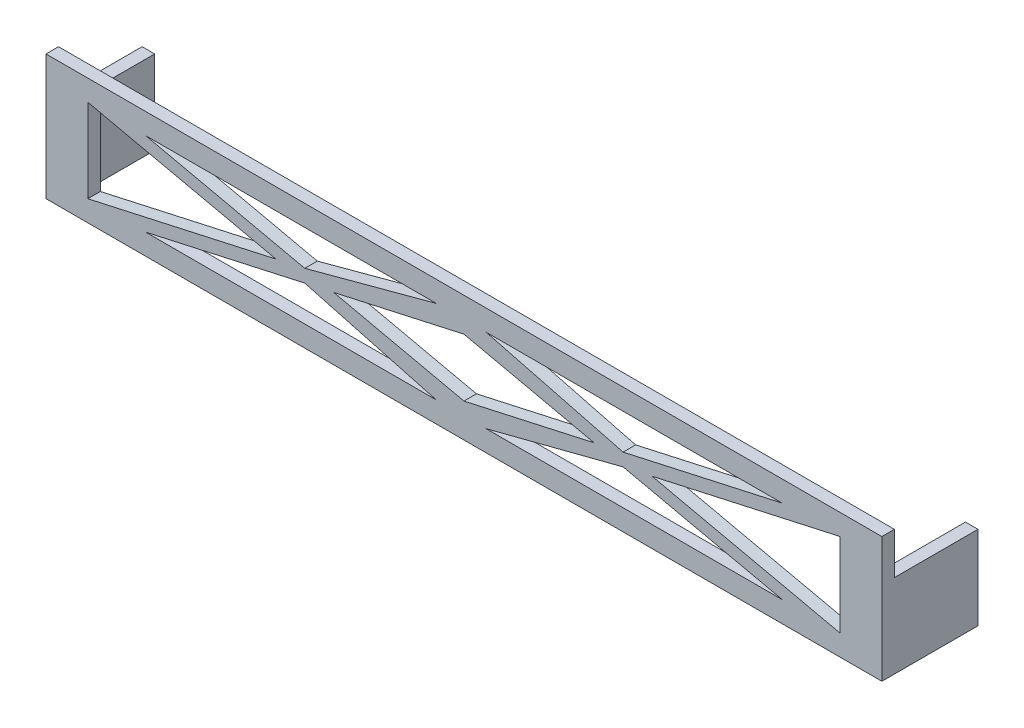
ISO-10303-21;
HEADER;
FILE_DESCRIPTION(('STEP AP214'),'2;1');
FILE_NAME('part.step','',(''),(''),'','','');
FILE_SCHEMA(('AUTOMOTIVE_DESIGN { 1 0 10303 214 1 1 1 1 }'));
ENDSEC;
DATA;
#1=APPLICATION_CONTEXT('core data for automotive mechanical design processes');
#2=APPLICATION_PROTOCOL_DEFINITION('international standard','automotive_design',2000,#1);
#3=PRODUCT_CONTEXT('',#1,'mechanical');
#4=PRODUCT('Part','Part','',(#3));
#5=PRODUCT_RELATED_PRODUCT_CATEGORY('part','',(#4));
#6=PRODUCT_DEFINITION_FORMATION('','',#4);
#7=PRODUCT_DEFINITION_CONTEXT('part definition',#1,'design');
#8=PRODUCT_DEFINITION('design','',#6,#7);
#9=PRODUCT_DEFINITION_SHAPE('','',#8);
#10=(LENGTH_UNIT() NAMED_UNIT(*) SI_UNIT(.MILLI.,.METRE.));
#11=(NAMED_UNIT(*) PLANE_ANGLE_UNIT() SI_UNIT($,.RADIAN.));
#12=(NAMED_UNIT(*) SI_UNIT($,.STERADIAN.) SOLID_ANGLE_UNIT());
#13=UNCERTAINTY_MEASURE_WITH_UNIT(LENGTH_MEASURE(1.E-05),#10,'distance_accuracy_value','');
#14=(GEOMETRIC_REPRESENTATION_CONTEXT(3) GLOBAL_UNCERTAINTY_ASSIGNED_CONTEXT((#13)) GLOBAL_UNIT_ASSIGNED_CONTEXT((#10,
#11,#12)) REPRESENTATION_CONTEXT('',''));
#15=CARTESIAN_POINT('',(0.,0.,0.));
#16=DIRECTION('',(0.,0.,1.));
#17=DIRECTION('',(1.,0.,0.));
#18=AXIS2_PLACEMENT_3D('',#15,#16,#17);
#19=CARTESIAN_POINT('',(0.,0.,3.));
#20=DIRECTION('',(0.,0.,1.));
#21=DIRECTION('',(1.,0.,0.));
#22=AXIS2_PLACEMENT_3D('',#19,#20,#21);
#23=PLANE('',#22);
#24=DIRECTION('',(0.,1.,0.));
#25=VECTOR('',#24,1.);
#26=CARTESIAN_POINT('',(-18.1595795878819,48.8517745302714,3.));
#27=LINE('',#26,#25);
#28=CARTESIAN_POINT('',(-18.1595795878819,18.8517745302714,3.));
#29=VERTEX_POINT('',#28);
#30=CARTESIAN_POINT('',(-18.1595795878819,48.8517745302714,3.));
#31=VERTEX_POINT('',#30);
#32=EDGE_CURVE('E476',#29,#31,#27,.T.);
#33=ORIENTED_EDGE('',*,*,#32,.T.);
#34=DIRECTION('',(-1.,0.,0.));
#35=VECTOR('',#34,1.);
#36=CARTESIAN_POINT('',(-218.159579587882,48.8517745302714,3.));
#37=LINE('',#36,#35);
#38=CARTESIAN_POINT('',(-218.159579587882,48.8517745302714,3.));
#39=VERTEX_POINT('',#38);
#40=EDGE_CURVE('E478',#31,#39,#37,.T.);
#41=ORIENTED_EDGE('',*,*,#40,.T.);
#42=DIRECTION('',(0.,-1.,0.));
#43=VECTOR('',#42,1.);
#44=CARTESIAN_POINT('',(-218.159579587882,48.8517745302714,3.));
#45=LINE('',#44,#43);
#46=CARTESIAN_POINT('',(-218.159579587882,18.8517745302714,3.));
#47=VERTEX_POINT('',#46);
#48=EDGE_CURVE('E471',#39,#47,#45,.T.);
#49=ORIENTED_EDGE('',*,*,#48,.T.);
#50=DIRECTION('',(1.,0.,0.));
#51=VECTOR('',#50,1.);
#52=CARTESIAN_POINT('',(-218.159579587882,18.8517745302714,3.));
#53=LINE('',#52,#51);
#54=EDGE_CURVE('E473',#47,#29,#53,.T.);
#55=ORIENTED_EDGE('',*,*,#54,.T.);
#56=EDGE_LOOP('',(#33,#41,#49,#55));
#57=FACE_BOUND('',#56,.T.);
#58=DIRECTION('',(0.976187060183952,0.216930457818658,0.));
#59=VECTOR('',#58,1.);
#60=CARTESIAN_POINT('',(-163.159579587882,33.8517745302714,3.));
#61=LINE('',#60,#59);
#62=CARTESIAN_POINT('',(-208.159579587882,23.8517745302713,3.));
#63=VERTEX_POINT('',#62);
#64=CARTESIAN_POINT('',(-163.159579587882,33.8517745302714,3.));
#65=VERTEX_POINT('',#64);
#66=EDGE_CURVE('E449',#63,#65,#61,.T.);
#67=ORIENTED_EDGE('',*,*,#66,.F.);
#68=DIRECTION('',(0.,-1.,0.));
#69=VECTOR('',#68,1.);
#70=CARTESIAN_POINT('',(-208.159579587882,43.8517745302714,3.));
#71=LINE('',#70,#69);
#72=CARTESIAN_POINT('',(-208.159579587882,43.8517745302714,3.));
#73=VERTEX_POINT('',#72);
#74=EDGE_CURVE('E447',#73,#63,#71,.T.);
#75=ORIENTED_EDGE('',*,*,#74,.F.);
#76=DIRECTION('',(-0.976187060183953,0.216930457818656,0.));
#77=VECTOR('',#76,1.);
#78=CARTESIAN_POINT('',(-208.159579587882,43.8517745302714,3.));
#79=LINE('',#78,#77);
#80=EDGE_CURVE('E453',#65,#73,#79,.T.);
#81=ORIENTED_EDGE('',*,*,#80,.F.);
#82=EDGE_LOOP('',(#67,#75,#81));
#83=FACE_BOUND('',#82,.T.);
#84=DIRECTION('',(0.,1.,0.));
#85=VECTOR('',#84,1.);
#86=CARTESIAN_POINT('',(-28.1595795878819,43.8517745302714,3.));
#87=LINE('',#86,#85);
#88=CARTESIAN_POINT('',(-28.1595795878819,23.8517745302714,3.));
#89=VERTEX_POINT('',#88);
#90=CARTESIAN_POINT('',(-28.1595795878819,43.8517745302714,3.));
#91=VERTEX_POINT('',#90);
#92=EDGE_CURVE('E425',#89,#91,#87,.T.);
#93=ORIENTED_EDGE('',*,*,#92,.F.);
#94=DIRECTION('',(0.976187060183953,-0.216930457818656,0.));
#95=VECTOR('',#94,1.);
#96=CARTESIAN_POINT('',(-73.1595795878819,33.8517745302714,3.));
#97=LINE('',#96,#95);
#98=CARTESIAN_POINT('',(-73.1595795878819,33.8517745302714,3.));
#99=VERTEX_POINT('',#98);
#100=EDGE_CURVE('E423',#99,#89,#97,.T.);
#101=ORIENTED_EDGE('',*,*,#100,.F.);
#102=DIRECTION('',(-0.976187060183953,-0.216930457818656,0.));
#103=VECTOR('',#102,1.);
#104=CARTESIAN_POINT('',(-28.1595795878819,43.8517745302714,3.));
#105=LINE('',#104,#103);
#106=EDGE_CURVE('E429',#91,#99,#105,.T.);
#107=ORIENTED_EDGE('',*,*,#106,.F.);
#108=EDGE_LOOP('',(#93,#101,#107));
#109=FACE_BOUND('',#108,.T.);
#110=DIRECTION('',(-0.965694542063238,0.259680672036394,0.));
#111=VECTOR('',#110,1.);
#112=CARTESIAN_POINT('',(-156.244921244912,32.3151837873893,3.));
#113=LINE('',#112,#111);
#114=CARTESIAN_POINT('',(-124.771388529698,23.8517745302714,3.));
#115=VERTEX_POINT('',#114);
#116=CARTESIAN_POINT('',(-156.244921244912,32.3151837873893,3.));
#117=VERTEX_POINT('',#116);
#118=EDGE_CURVE('E401',#115,#117,#113,.T.);
#119=ORIENTED_EDGE('',*,*,#118,.F.);
#120=DIRECTION('',(1.,0.,0.));
#121=VECTOR('',#120,1.);
#122=CARTESIAN_POINT('',(-194.330262901943,23.8517745302713,3.));
#123=LINE('',#122,#121);
#124=CARTESIAN_POINT('',(-194.330262901943,23.8517745302713,3.));
#125=VERTEX_POINT('',#124);
#126=EDGE_CURVE('E399',#125,#115,#123,.T.);
#127=ORIENTED_EDGE('',*,*,#126,.F.);
#128=DIRECTION('',(-0.976187060183952,-0.216930457818658,0.));
#129=VECTOR('',#128,1.);
#130=CARTESIAN_POINT('',(-194.330262901943,23.8517745302713,3.));
#131=LINE('',#130,#129);
#132=EDGE_CURVE('E405',#117,#125,#131,.T.);
#133=ORIENTED_EDGE('',*,*,#132,.F.);
#134=EDGE_LOOP('',(#119,#127,#133));
#135=FACE_BOUND('',#134,.T.);
#136=DIRECTION('',(0.976187060183953,-0.216930457818656,0.));
#137=VECTOR('',#136,1.);
#138=CARTESIAN_POINT('',(-194.330262901943,43.8517745302714,3.));
#139=LINE('',#138,#137);
#140=CARTESIAN_POINT('',(-194.330262901943,43.8517745302714,3.));
#141=VERTEX_POINT('',#140);
#142=CARTESIAN_POINT('',(-156.244921244912,35.3883652731535,3.));
#143=VERTEX_POINT('',#142);
#144=EDGE_CURVE('E377',#141,#143,#139,.T.);
#145=ORIENTED_EDGE('',*,*,#144,.F.);
#146=DIRECTION('',(-1.,0.,0.));
#147=VECTOR('',#146,1.);
#148=CARTESIAN_POINT('',(-124.771388529698,43.8517745302714,3.));
#149=LINE('',#148,#147);
#150=CARTESIAN_POINT('',(-124.771388529698,43.8517745302714,3.));
#151=VERTEX_POINT('',#150);
#152=EDGE_CURVE('E375',#151,#141,#149,.T.);
#153=ORIENTED_EDGE('',*,*,#152,.F.);
#154=DIRECTION('',(0.965694542063238,0.259680672036393,0.));
#155=VECTOR('',#154,1.);
#156=CARTESIAN_POINT('',(-156.244921244912,35.3883652731535,3.));
#157=LINE('',#156,#155);
#158=EDGE_CURVE('E381',#143,#151,#157,.T.);
#159=ORIENTED_EDGE('',*,*,#158,.F.);
#160=EDGE_LOOP('',(#145,#153,#159));
#161=FACE_BOUND('',#160,.T.);
#162=DIRECTION('',(-0.976187060183952,0.216930457818658,0.));
#163=VECTOR('',#162,1.);
#164=CARTESIAN_POINT('',(-118.159579587882,40.7785930445072,3.));
#165=LINE('',#164,#163);
#166=CARTESIAN_POINT('',(-86.9888962738211,33.8517745302714,3.));
#167=VERTEX_POINT('',#166);
#168=CARTESIAN_POINT('',(-118.159579587882,40.7785930445072,3.));
#169=VERTEX_POINT('',#168);
#170=EDGE_CURVE('E346',#167,#169,#165,.T.);
#171=ORIENTED_EDGE('',*,*,#170,.F.);
#172=DIRECTION('',(0.976187060183953,0.216930457818656,0.));
#173=VECTOR('',#172,1.);
#174=CARTESIAN_POINT('',(-86.9888962738211,33.8517745302714,3.));
#175=LINE('',#174,#173);
#176=CARTESIAN_POINT('',(-118.159579587882,26.9249560160357,3.));
#177=VERTEX_POINT('',#176);
#178=EDGE_CURVE('E344',#177,#167,#175,.T.);
#179=ORIENTED_EDGE('',*,*,#178,.F.);
#180=DIRECTION('',(0.976187060183953,-0.216930457818656,0.));
#181=VECTOR('',#180,1.);
#182=CARTESIAN_POINT('',(-149.330262901943,33.8517745302714,3.));
#183=LINE('',#182,#181);
#184=CARTESIAN_POINT('',(-149.330262901943,33.8517745302714,3.));
#185=VERTEX_POINT('',#184);
#186=EDGE_CURVE('E352',#185,#177,#183,.T.);
#187=ORIENTED_EDGE('',*,*,#186,.F.);
#188=DIRECTION('',(-0.976187060183952,-0.216930457818658,0.));
#189=VECTOR('',#188,1.);
#190=CARTESIAN_POINT('',(-118.159579587882,40.7785930445072,3.));
#191=LINE('',#190,#189);
#192=EDGE_CURVE('E349',#169,#185,#191,.T.);
#193=ORIENTED_EDGE('',*,*,#192,.F.);
#194=EDGE_LOOP('',(#171,#179,#187,#193));
#195=FACE_BOUND('',#194,.T.);
#196=DIRECTION('',(1.,0.,0.));
#197=VECTOR('',#196,1.);
#198=CARTESIAN_POINT('',(-112.871999427657,23.8517745302714,3.));
#199=LINE('',#198,#197);
#200=CARTESIAN_POINT('',(-112.871999427657,23.8517745302714,3.));
#201=VERTEX_POINT('',#200);
#202=CARTESIAN_POINT('',(-41.9888962738212,23.8517745302714,3.));
#203=VERTEX_POINT('',#202);
#204=EDGE_CURVE('E322',#201,#203,#199,.T.);
#205=ORIENTED_EDGE('',*,*,#204,.F.);
#206=DIRECTION('',(-0.968281103667412,-0.249863371226394,0.));
#207=VECTOR('',#206,1.);
#208=CARTESIAN_POINT('',(-80.0742379308515,32.3151837873893,3.));
#209=LINE('',#208,#207);
#210=CARTESIAN_POINT('',(-80.0742379308515,32.3151837873893,3.));
#211=VERTEX_POINT('',#210);
#212=EDGE_CURVE('E320',#211,#201,#209,.T.);
#213=ORIENTED_EDGE('',*,*,#212,.F.);
#214=DIRECTION('',(-0.976187060183953,0.216930457818657,0.));
#215=VECTOR('',#214,1.);
#216=CARTESIAN_POINT('',(-41.9888962738212,23.8517745302714,3.));
#217=LINE('',#216,#215);
#218=EDGE_CURVE('E326',#203,#211,#217,.T.);
#219=ORIENTED_EDGE('',*,*,#218,.F.);
#220=EDGE_LOOP('',(#205,#213,#219));
#221=FACE_BOUND('',#220,.T.);
#222=DIRECTION('',(0.976187060183953,0.216930457818656,0.));
#223=VECTOR('',#222,1.);
#224=CARTESIAN_POINT('',(-41.9888962738212,43.8517745302714,3.));
#225=LINE('',#224,#223);
#226=CARTESIAN_POINT('',(-80.0742379308515,35.3883652731535,3.));
#227=VERTEX_POINT('',#226);
#228=CARTESIAN_POINT('',(-41.9888962738212,43.8517745302714,3.));
#229=VERTEX_POINT('',#228);
#230=EDGE_CURVE('E298',#227,#229,#225,.T.);
#231=ORIENTED_EDGE('',*,*,#230,.F.);
#232=DIRECTION('',(0.968281103667412,-0.249863371226393,0.));
#233=VECTOR('',#232,1.);
#234=CARTESIAN_POINT('',(-80.0742379308515,35.3883652731535,3.));
#235=LINE('',#234,#233);
#236=CARTESIAN_POINT('',(-112.871999427657,43.8517745302714,3.));
#237=VERTEX_POINT('',#236);
#238=EDGE_CURVE('E296',#237,#227,#235,.T.);
#239=ORIENTED_EDGE('',*,*,#238,.F.);
#240=DIRECTION('',(-1.,0.,0.));
#241=VECTOR('',#240,1.);
#242=CARTESIAN_POINT('',(-41.9888962738212,43.8517745302714,3.));
#243=LINE('',#242,#241);
#244=EDGE_CURVE('E302',#229,#237,#243,.T.);
#245=ORIENTED_EDGE('',*,*,#244,.F.);
#246=EDGE_LOOP('',(#231,#239,#245));
#247=FACE_BOUND('',#246,.T.);
#248=ADVANCED_FACE('F33',(#57,#83,#109,#135,#161,#195,#221,#247),#23,.T.);
#249=CARTESIAN_POINT('',(0.,0.,0.));
#250=DIRECTION('',(0.,0.,1.));
#251=DIRECTION('',(1.,0.,0.));
#252=AXIS2_PLACEMENT_3D('',#249,#250,#251);
#253=PLANE('',#252);
#254=DIRECTION('',(-0.968281103667412,-0.249863371226394,0.));
#255=VECTOR('',#254,1.);
#256=CARTESIAN_POINT('',(-80.0742379308515,32.3151837873893,0.));
#257=LINE('',#256,#255);
#258=CARTESIAN_POINT('',(-80.0742379308515,32.3151837873893,0.));
#259=VERTEX_POINT('',#258);
#260=CARTESIAN_POINT('',(-112.871999427657,23.8517745302714,0.));
#261=VERTEX_POINT('',#260);
#262=EDGE_CURVE('E319',#259,#261,#257,.T.);
#263=ORIENTED_EDGE('',*,*,#262,.T.);
#264=DIRECTION('',(1.,0.,0.));
#265=VECTOR('',#264,1.);
#266=CARTESIAN_POINT('',(-112.871999427657,23.8517745302714,0.));
#267=LINE('',#266,#265);
#268=CARTESIAN_POINT('',(-41.9888962738212,23.8517745302714,0.));
#269=VERTEX_POINT('',#268);
#270=EDGE_CURVE('E331',#261,#269,#267,.T.);
#271=ORIENTED_EDGE('',*,*,#270,.T.);
#272=DIRECTION('',(-0.976187060183953,0.216930457818657,0.));
#273=VECTOR('',#272,1.);
#274=CARTESIAN_POINT('',(-41.9888962738212,23.8517745302714,0.));
#275=LINE('',#274,#273);
#276=EDGE_CURVE('E323',#269,#259,#275,.T.);
#277=ORIENTED_EDGE('',*,*,#276,.T.);
#278=EDGE_LOOP('',(#263,#271,#277));
#279=FACE_BOUND('',#278,.T.);
#280=DIRECTION('',(-1.,0.,0.));
#281=VECTOR('',#280,1.);
#282=CARTESIAN_POINT('',(-124.771388529698,43.8517745302714,0.));
#283=LINE('',#282,#281);
#284=CARTESIAN_POINT('',(-124.771388529698,43.8517745302714,0.));
#285=VERTEX_POINT('',#284);
#286=CARTESIAN_POINT('',(-194.330262901943,43.8517745302714,0.));
#287=VERTEX_POINT('',#286);
#288=EDGE_CURVE('E374',#285,#287,#283,.T.);
#289=ORIENTED_EDGE('',*,*,#288,.T.);
#290=DIRECTION('',(0.976187060183953,-0.216930457818656,0.));
#291=VECTOR('',#290,1.);
#292=CARTESIAN_POINT('',(-194.330262901943,43.8517745302714,0.));
#293=LINE('',#292,#291);
#294=CARTESIAN_POINT('',(-156.244921244912,35.3883652731535,0.));
#295=VERTEX_POINT('',#294);
#296=EDGE_CURVE('E386',#287,#295,#293,.T.);
#297=ORIENTED_EDGE('',*,*,#296,.T.);
#298=DIRECTION('',(0.965694542063238,0.259680672036393,0.));
#299=VECTOR('',#298,1.);
#300=CARTESIAN_POINT('',(-156.244921244912,35.3883652731535,0.));
#301=LINE('',#300,#299);
#302=EDGE_CURVE('E378',#295,#285,#301,.T.);
#303=ORIENTED_EDGE('',*,*,#302,.T.);
#304=EDGE_LOOP('',(#289,#297,#303));
#305=FACE_BOUND('',#304,.T.);
#306=DIRECTION('',(0.976187060183953,-0.216930457818656,0.));
#307=VECTOR('',#306,1.);
#308=CARTESIAN_POINT('',(-73.1595795878819,33.8517745302714,0.));
#309=LINE('',#308,#307);
#310=CARTESIAN_POINT('',(-73.1595795878819,33.8517745302714,0.));
#311=VERTEX_POINT('',#310);
#312=CARTESIAN_POINT('',(-28.1595795878819,23.8517745302714,0.));
#313=VERTEX_POINT('',#312);
#314=EDGE_CURVE('E422',#311,#313,#309,.T.);
#315=ORIENTED_EDGE('',*,*,#314,.T.);
#316=DIRECTION('',(0.,1.,0.));
#317=VECTOR('',#316,1.);
#318=CARTESIAN_POINT('',(-28.1595795878819,43.8517745302714,0.));
#319=LINE('',#318,#317);
#320=CARTESIAN_POINT('',(-28.1595795878819,43.8517745302714,0.));
#321=VERTEX_POINT('',#320);
#322=EDGE_CURVE('E434',#313,#321,#319,.T.);
#323=ORIENTED_EDGE('',*,*,#322,.T.);
#324=DIRECTION('',(-0.976187060183953,-0.216930457818656,0.));
#325=VECTOR('',#324,1.);
#326=CARTESIAN_POINT('',(-28.1595795878819,43.8517745302714,0.));
#327=LINE('',#326,#325);
#328=EDGE_CURVE('E426',#321,#311,#327,.T.);
#329=ORIENTED_EDGE('',*,*,#328,.T.);
#330=EDGE_LOOP('',(#315,#323,#329));
#331=FACE_BOUND('',#330,.T.);
#332=DIRECTION('',(0.,1.,0.));
#333=VECTOR('',#332,1.);
#334=CARTESIAN_POINT('',(-18.1595795878819,48.8517745302714,0.));
#335=LINE('',#334,#333);
#336=CARTESIAN_POINT('',(-18.1595795878819,38.8517745302714,0.));
#337=VERTEX_POINT('',#336);
#338=CARTESIAN_POINT('',(-18.1595795878819,48.8517745302714,0.));
#339=VERTEX_POINT('',#338);
#340=EDGE_CURVE('E485',#337,#339,#335,.T.);
#341=ORIENTED_EDGE('',*,*,#340,.F.);
#342=DIRECTION('',(-1.,0.,0.));
#343=VECTOR('',#342,1.);
#344=CARTESIAN_POINT('',(0.,38.8517745302714,0.));
#345=LINE('',#344,#343);
#346=CARTESIAN_POINT('',(-21.1595795878819,38.8517745302714,0.));
#347=VERTEX_POINT('',#346);
#348=EDGE_CURVE('E268',#337,#347,#345,.T.);
#349=ORIENTED_EDGE('',*,*,#348,.T.);
#350=DIRECTION('',(0.,-1.,0.));
#351=VECTOR('',#350,1.);
#352=CARTESIAN_POINT('',(-21.1595795878819,0.,0.));
#353=LINE('',#352,#351);
#354=CARTESIAN_POINT('',(-21.1595795878819,18.8517745302714,0.));
#355=VERTEX_POINT('',#354);
#356=EDGE_CURVE('E244',#347,#355,#353,.T.);
#357=ORIENTED_EDGE('',*,*,#356,.T.);
#358=DIRECTION('',(1.,0.,0.));
#359=VECTOR('',#358,1.);
#360=CARTESIAN_POINT('',(-218.159579587882,18.8517745302714,0.));
#361=LINE('',#360,#359);
#362=CARTESIAN_POINT('',(-215.159579587882,18.8517745302714,0.));
#363=VERTEX_POINT('',#362);
#364=EDGE_CURVE('E483',#363,#355,#361,.T.);
#365=ORIENTED_EDGE('',*,*,#364,.F.);
#366=DIRECTION('',(0.,1.,0.));
#367=VECTOR('',#366,1.);
#368=CARTESIAN_POINT('',(-215.159579587882,0.,0.));
#369=LINE('',#368,#367);
#370=CARTESIAN_POINT('',(-215.159579587882,38.8517745302714,0.));
#371=VERTEX_POINT('',#370);
#372=EDGE_CURVE('E285',#363,#371,#369,.T.);
#373=ORIENTED_EDGE('',*,*,#372,.T.);
#374=DIRECTION('',(-1.,0.,0.));
#375=VECTOR('',#374,1.);
#376=CARTESIAN_POINT('',(0.,38.8517745302714,0.));
#377=LINE('',#376,#375);
#378=CARTESIAN_POINT('',(-218.159579587882,38.8517745302714,0.));
#379=VERTEX_POINT('',#378);
#380=EDGE_CURVE('E292',#371,#379,#377,.T.);
#381=ORIENTED_EDGE('',*,*,#380,.T.);
#382=DIRECTION('',(0.,-1.,0.));
#383=VECTOR('',#382,1.);
#384=CARTESIAN_POINT('',(-218.159579587882,48.8517745302714,0.));
#385=LINE('',#384,#383);
#386=CARTESIAN_POINT('',(-218.159579587882,48.8517745302714,0.));
#387=VERTEX_POINT('',#386);
#388=EDGE_CURVE('E470',#387,#379,#385,.T.);
#389=ORIENTED_EDGE('',*,*,#388,.F.);
#390=DIRECTION('',(-1.,0.,0.));
#391=VECTOR('',#390,1.);
#392=CARTESIAN_POINT('',(-218.159579587882,48.8517745302714,0.));
#393=LINE('',#392,#391);
#394=EDGE_CURVE('E474',#339,#387,#393,.T.);
#395=ORIENTED_EDGE('',*,*,#394,.F.);
#396=EDGE_LOOP('',(#341,#349,#357,#365,#373,#381,#389,#395));
#397=FACE_BOUND('',#396,.T.);
#398=DIRECTION('',(0.,-1.,0.));
#399=VECTOR('',#398,1.);
#400=CARTESIAN_POINT('',(-208.159579587882,43.8517745302714,0.));
#401=LINE('',#400,#399);
#402=CARTESIAN_POINT('',(-208.159579587882,43.8517745302714,0.));
#403=VERTEX_POINT('',#402);
#404=CARTESIAN_POINT('',(-208.159579587882,23.8517745302713,0.));
#405=VERTEX_POINT('',#404);
#406=EDGE_CURVE('E446',#403,#405,#401,.T.);
#407=ORIENTED_EDGE('',*,*,#406,.T.);
#408=DIRECTION('',(0.976187060183952,0.216930457818658,0.));
#409=VECTOR('',#408,1.);
#410=CARTESIAN_POINT('',(-163.159579587882,33.8517745302714,0.));
#411=LINE('',#410,#409);
#412=CARTESIAN_POINT('',(-163.159579587882,33.8517745302714,0.));
#413=VERTEX_POINT('',#412);
#414=EDGE_CURVE('E458',#405,#413,#411,.T.);
#415=ORIENTED_EDGE('',*,*,#414,.T.);
#416=DIRECTION('',(-0.976187060183953,0.216930457818656,0.));
#417=VECTOR('',#416,1.);
#418=CARTESIAN_POINT('',(-208.159579587882,43.8517745302714,0.));
#419=LINE('',#418,#417);
#420=EDGE_CURVE('E450',#413,#403,#419,.T.);
#421=ORIENTED_EDGE('',*,*,#420,.T.);
#422=EDGE_LOOP('',(#407,#415,#421));
#423=FACE_BOUND('',#422,.T.);
#424=DIRECTION('',(1.,0.,0.));
#425=VECTOR('',#424,1.);
#426=CARTESIAN_POINT('',(-194.330262901943,23.8517745302713,0.));
#427=LINE('',#426,#425);
#428=CARTESIAN_POINT('',(-194.330262901943,23.8517745302713,0.));
#429=VERTEX_POINT('',#428);
#430=CARTESIAN_POINT('',(-124.771388529698,23.8517745302714,0.));
#431=VERTEX_POINT('',#430);
#432=EDGE_CURVE('E398',#429,#431,#427,.T.);
#433=ORIENTED_EDGE('',*,*,#432,.T.);
#434=DIRECTION('',(-0.965694542063238,0.259680672036394,0.));
#435=VECTOR('',#434,1.);
#436=CARTESIAN_POINT('',(-156.244921244912,32.3151837873893,0.));
#437=LINE('',#436,#435);
#438=CARTESIAN_POINT('',(-156.244921244912,32.3151837873893,0.));
#439=VERTEX_POINT('',#438);
#440=EDGE_CURVE('E410',#431,#439,#437,.T.);
#441=ORIENTED_EDGE('',*,*,#440,.T.);
#442=DIRECTION('',(-0.976187060183952,-0.216930457818658,0.));
#443=VECTOR('',#442,1.);
#444=CARTESIAN_POINT('',(-194.330262901943,23.8517745302713,0.));
#445=LINE('',#444,#443);
#446=EDGE_CURVE('E402',#439,#429,#445,.T.);
#447=ORIENTED_EDGE('',*,*,#446,.T.);
#448=EDGE_LOOP('',(#433,#441,#447));
#449=FACE_BOUND('',#448,.T.);
#450=DIRECTION('',(0.976187060183953,0.216930457818656,0.));
#451=VECTOR('',#450,1.);
#452=CARTESIAN_POINT('',(-86.9888962738211,33.8517745302714,0.));
#453=LINE('',#452,#451);
#454=CARTESIAN_POINT('',(-118.159579587882,26.9249560160357,0.));
#455=VERTEX_POINT('',#454);
#456=CARTESIAN_POINT('',(-86.9888962738211,33.8517745302714,0.));
#457=VERTEX_POINT('',#456);
#458=EDGE_CURVE('E343',#455,#457,#453,.T.);
#459=ORIENTED_EDGE('',*,*,#458,.T.);
#460=DIRECTION('',(-0.976187060183952,0.216930457818658,0.));
#461=VECTOR('',#460,1.);
#462=CARTESIAN_POINT('',(-118.159579587882,40.7785930445072,0.));
#463=LINE('',#462,#461);
#464=CARTESIAN_POINT('',(-118.159579587882,40.7785930445072,0.));
#465=VERTEX_POINT('',#464);
#466=EDGE_CURVE('E357',#457,#465,#463,.T.);
#467=ORIENTED_EDGE('',*,*,#466,.T.);
#468=DIRECTION('',(-0.976187060183952,-0.216930457818658,0.));
#469=VECTOR('',#468,1.);
#470=CARTESIAN_POINT('',(-118.159579587882,40.7785930445072,0.));
#471=LINE('',#470,#469);
#472=CARTESIAN_POINT('',(-149.330262901943,33.8517745302714,0.));
#473=VERTEX_POINT('',#472);
#474=EDGE_CURVE('E360',#465,#473,#471,.T.);
#475=ORIENTED_EDGE('',*,*,#474,.T.);
#476=DIRECTION('',(0.976187060183953,-0.216930457818656,0.));
#477=VECTOR('',#476,1.);
#478=CARTESIAN_POINT('',(-149.330262901943,33.8517745302714,0.));
#479=LINE('',#478,#477);
#480=EDGE_CURVE('E347',#473,#455,#479,.T.);
#481=ORIENTED_EDGE('',*,*,#480,.T.);
#482=EDGE_LOOP('',(#459,#467,#475,#481));
#483=FACE_BOUND('',#482,.T.);
#484=DIRECTION('',(0.968281103667412,-0.249863371226393,0.));
#485=VECTOR('',#484,1.);
#486=CARTESIAN_POINT('',(-80.0742379308515,35.3883652731535,0.));
#487=LINE('',#486,#485);
#488=CARTESIAN_POINT('',(-112.871999427657,43.8517745302714,0.));
#489=VERTEX_POINT('',#488);
#490=CARTESIAN_POINT('',(-80.0742379308515,35.3883652731535,0.));
#491=VERTEX_POINT('',#490);
#492=EDGE_CURVE('E295',#489,#491,#487,.T.);
#493=ORIENTED_EDGE('',*,*,#492,.T.);
#494=DIRECTION('',(0.976187060183953,0.216930457818656,0.));
#495=VECTOR('',#494,1.);
#496=CARTESIAN_POINT('',(-41.9888962738212,43.8517745302714,0.));
#497=LINE('',#496,#495);
#498=CARTESIAN_POINT('',(-41.9888962738212,43.8517745302714,0.));
#499=VERTEX_POINT('',#498);
#500=EDGE_CURVE('E307',#491,#499,#497,.T.);
#501=ORIENTED_EDGE('',*,*,#500,.T.);
#502=DIRECTION('',(-1.,0.,0.));
#503=VECTOR('',#502,1.);
#504=CARTESIAN_POINT('',(-41.9888962738212,43.8517745302714,0.));
#505=LINE('',#504,#503);
#506=EDGE_CURVE('E299',#499,#489,#505,.T.);
#507=ORIENTED_EDGE('',*,*,#506,.T.);
#508=EDGE_LOOP('',(#493,#501,#507));
#509=FACE_BOUND('',#508,.T.);
#510=ADVANCED_FACE('F502',(#279,#305,#331,#397,#423,#449,#483,#509),#253,.F.);
#511=CARTESIAN_POINT('',(-218.159579587882,48.8517745302714,3.));
#512=DIRECTION('',(1.,0.,0.));
#513=DIRECTION('',(0.,0.,-1.));
#514=AXIS2_PLACEMENT_3D('',#511,#512,#513);
#515=PLANE('',#514);
#516=ORIENTED_EDGE('',*,*,#388,.T.);
#517=DIRECTION('',(0.,0.,1.));
#518=VECTOR('',#517,1.);
#519=CARTESIAN_POINT('',(-218.159579587882,38.8517745302714,-20.));
#520=LINE('',#519,#518);
#521=CARTESIAN_POINT('',(-218.159579587882,38.8517745302714,-20.));
#522=VERTEX_POINT('',#521);
#523=EDGE_CURVE('E283',#522,#379,#520,.T.);
#524=ORIENTED_EDGE('',*,*,#523,.F.);
#525=DIRECTION('',(0.,-1.,0.));
#526=VECTOR('',#525,1.);
#527=CARTESIAN_POINT('',(-218.159579587882,38.8517745302714,-20.));
#528=LINE('',#527,#526);
#529=CARTESIAN_POINT('',(-218.159579587882,18.8517745302714,-20.));
#530=VERTEX_POINT('',#529);
#531=EDGE_CURVE('E272',#522,#530,#528,.T.);
#532=ORIENTED_EDGE('',*,*,#531,.T.);
#533=DIRECTION('',(0.,0.,-1.));
#534=VECTOR('',#533,1.);
#535=CARTESIAN_POINT('',(-218.159579587882,18.8517745302714,3.));
#536=LINE('',#535,#534);
#537=EDGE_CURVE('E11',#47,#530,#536,.T.);
#538=ORIENTED_EDGE('',*,*,#537,.F.);
#539=ORIENTED_EDGE('',*,*,#48,.F.);
#540=DIRECTION('',(0.,0.,-1.));
#541=VECTOR('',#540,1.);
#542=CARTESIAN_POINT('',(-218.159579587882,48.8517745302714,3.));
#543=LINE('',#542,#541);
#544=EDGE_CURVE('E480',#39,#387,#543,.T.);
#545=ORIENTED_EDGE('',*,*,#544,.T.);
#546=EDGE_LOOP('',(#516,#524,#532,#538,#539,#545));
#547=FACE_BOUND('',#546,.T.);
#548=ADVANCED_FACE('F35',(#547),#515,.F.);
#549=CARTESIAN_POINT('',(-218.159579587882,18.8517745302714,3.));
#550=DIRECTION('',(0.,1.,0.));
#551=DIRECTION('',(0.,0.,1.));
#552=AXIS2_PLACEMENT_3D('',#549,#550,#551);
#553=PLANE('',#552);
#554=ORIENTED_EDGE('',*,*,#364,.T.);
#555=DIRECTION('',(0.,0.,1.));
#556=VECTOR('',#555,1.);
#557=CARTESIAN_POINT('',(-21.1595795878819,18.8517745302714,-20.));
#558=LINE('',#557,#556);
#559=CARTESIAN_POINT('',(-21.1595795878819,18.8517745302714,-20.));
#560=VERTEX_POINT('',#559);
#561=EDGE_CURVE('E48',#560,#355,#558,.T.);
#562=ORIENTED_EDGE('',*,*,#561,.F.);
#563=DIRECTION('',(1.,0.,0.));
#564=VECTOR('',#563,1.);
#565=CARTESIAN_POINT('',(-18.1595795878819,18.8517745302714,-20.));
#566=LINE('',#565,#564);
#567=CARTESIAN_POINT('',(-18.1595795878819,18.8517745302714,-20.));
#568=VERTEX_POINT('',#567);
#569=EDGE_CURVE('E258',#560,#568,#566,.T.);
#570=ORIENTED_EDGE('',*,*,#569,.T.);
#571=DIRECTION('',(0.,0.,-1.));
#572=VECTOR('',#571,1.);
#573=CARTESIAN_POINT('',(-18.1595795878819,18.8517745302714,3.));
#574=LINE('',#573,#572);
#575=EDGE_CURVE('E41',#29,#568,#574,.T.);
#576=ORIENTED_EDGE('',*,*,#575,.F.);
#577=ORIENTED_EDGE('',*,*,#54,.F.);
#578=ORIENTED_EDGE('',*,*,#537,.T.);
#579=DIRECTION('',(1.,0.,0.));
#580=VECTOR('',#579,1.);
#581=CARTESIAN_POINT('',(-218.159579587882,18.8517745302714,-20.));
#582=LINE('',#581,#580);
#583=CARTESIAN_POINT('',(-215.159579587882,18.8517745302714,-20.));
#584=VERTEX_POINT('',#583);
#585=EDGE_CURVE('E275',#530,#584,#582,.T.);
#586=ORIENTED_EDGE('',*,*,#585,.T.);
#587=DIRECTION('',(0.,0.,1.));
#588=VECTOR('',#587,1.);
#589=CARTESIAN_POINT('',(-215.159579587882,18.8517745302714,-20.));
#590=LINE('',#589,#588);
#591=EDGE_CURVE('E56',#584,#363,#590,.T.);
#592=ORIENTED_EDGE('',*,*,#591,.T.);
#593=EDGE_LOOP('',(#554,#562,#570,#576,#577,#578,#586,#592));
#594=FACE_BOUND('',#593,.T.);
#595=ADVANCED_FACE('F498',(#594),#553,.F.);
#596=CARTESIAN_POINT('',(-18.1595795878819,48.8517745302714,3.));
#597=DIRECTION('',(-1.,0.,0.));
#598=DIRECTION('',(0.,0.,1.));
#599=AXIS2_PLACEMENT_3D('',#596,#597,#598);
#600=PLANE('',#599);
#601=DIRECTION('',(0.,0.,-1.));
#602=VECTOR('',#601,1.);
#603=CARTESIAN_POINT('',(-18.1595795878819,48.8517745302714,3.));
#604=LINE('',#603,#602);
#605=EDGE_CURVE('E490',#31,#339,#604,.T.);
#606=ORIENTED_EDGE('',*,*,#605,.F.);
#607=ORIENTED_EDGE('',*,*,#32,.F.);
#608=ORIENTED_EDGE('',*,*,#575,.T.);
#609=DIRECTION('',(0.,1.,0.));
#610=VECTOR('',#609,1.);
#611=CARTESIAN_POINT('',(-18.1595795878819,38.8517745302714,-20.));
#612=LINE('',#611,#610);
#613=CARTESIAN_POINT('',(-18.1595795878819,38.8517745302714,-20.));
#614=VERTEX_POINT('',#613);
#615=EDGE_CURVE('E248',#568,#614,#612,.T.);
#616=ORIENTED_EDGE('',*,*,#615,.T.);
#617=DIRECTION('',(0.,0.,1.));
#618=VECTOR('',#617,1.);
#619=CARTESIAN_POINT('',(-18.1595795878819,38.8517745302714,-20.));
#620=LINE('',#619,#618);
#621=EDGE_CURVE('E262',#614,#337,#620,.T.);
#622=ORIENTED_EDGE('',*,*,#621,.T.);
#623=ORIENTED_EDGE('',*,*,#340,.T.);
#624=EDGE_LOOP('',(#606,#607,#608,#616,#622,#623));
#625=FACE_BOUND('',#624,.T.);
#626=ADVANCED_FACE('F496',(#625),#600,.F.);
#627=CARTESIAN_POINT('',(-218.159579587882,48.8517745302714,3.));
#628=DIRECTION('',(0.,-1.,0.));
#629=DIRECTION('',(0.,0.,-1.));
#630=AXIS2_PLACEMENT_3D('',#627,#628,#629);
#631=PLANE('',#630);
#632=ORIENTED_EDGE('',*,*,#394,.T.);
#633=ORIENTED_EDGE('',*,*,#544,.F.);
#634=ORIENTED_EDGE('',*,*,#40,.F.);
#635=ORIENTED_EDGE('',*,*,#605,.T.);
#636=EDGE_LOOP('',(#632,#633,#634,#635));
#637=FACE_BOUND('',#636,.T.);
#638=ADVANCED_FACE('F507',(#637),#631,.F.);
#639=CARTESIAN_POINT('',(-208.159579587882,43.8517745302714,3.));
#640=DIRECTION('',(1.,0.,0.));
#641=DIRECTION('',(0.,0.,-1.));
#642=AXIS2_PLACEMENT_3D('',#639,#640,#641);
#643=PLANE('',#642);
#644=ORIENTED_EDGE('',*,*,#406,.F.);
#645=DIRECTION('',(0.,0.,-1.));
#646=VECTOR('',#645,1.);
#647=CARTESIAN_POINT('',(-208.159579587882,43.8517745302714,3.));
#648=LINE('',#647,#646);
#649=EDGE_CURVE('E455',#73,#403,#648,.T.);
#650=ORIENTED_EDGE('',*,*,#649,.F.);
#651=ORIENTED_EDGE('',*,*,#74,.T.);
#652=DIRECTION('',(0.,0.,-1.));
#653=VECTOR('',#652,1.);
#654=CARTESIAN_POINT('',(-208.159579587882,23.8517745302713,3.));
#655=LINE('',#654,#653);
#656=EDGE_CURVE('E467',#63,#405,#655,.T.);
#657=ORIENTED_EDGE('',*,*,#656,.T.);
#658=EDGE_LOOP('',(#644,#650,#651,#657));
#659=FACE_BOUND('',#658,.T.);
#660=ADVANCED_FACE('F545',(#659),#643,.T.);
#661=CARTESIAN_POINT('',(-163.159579587882,33.8517745302714,3.));
#662=DIRECTION('',(-0.216930457818658,0.976187060183952,0.));
#663=DIRECTION('',(-0.976187060183953,-0.216930457818658,0.));
#664=AXIS2_PLACEMENT_3D('',#661,#662,#663);
#665=PLANE('',#664);
#666=ORIENTED_EDGE('',*,*,#414,.F.);
#667=ORIENTED_EDGE('',*,*,#656,.F.);
#668=ORIENTED_EDGE('',*,*,#66,.T.);
#669=DIRECTION('',(0.,0.,-1.));
#670=VECTOR('',#669,1.);
#671=CARTESIAN_POINT('',(-163.159579587882,33.8517745302714,3.));
#672=LINE('',#671,#670);
#673=EDGE_CURVE('E465',#65,#413,#672,.T.);
#674=ORIENTED_EDGE('',*,*,#673,.T.);
#675=EDGE_LOOP('',(#666,#667,#668,#674));
#676=FACE_BOUND('',#675,.T.);
#677=ADVANCED_FACE('F761',(#676),#665,.T.);
#678=CARTESIAN_POINT('',(-208.159579587882,43.8517745302714,3.));
#679=DIRECTION('',(-0.216930457818656,-0.976187060183953,0.));
#680=DIRECTION('',(0.976187060183953,-0.216930457818656,0.));
#681=AXIS2_PLACEMENT_3D('',#678,#679,#680);
#682=PLANE('',#681);
#683=ORIENTED_EDGE('',*,*,#420,.F.);
#684=ORIENTED_EDGE('',*,*,#673,.F.);
#685=ORIENTED_EDGE('',*,*,#80,.T.);
#686=ORIENTED_EDGE('',*,*,#649,.T.);
#687=EDGE_LOOP('',(#683,#684,#685,#686));
#688=FACE_BOUND('',#687,.T.);
#689=ADVANCED_FACE('F751',(#688),#682,.T.);
#690=CARTESIAN_POINT('',(-73.1595795878819,33.8517745302714,3.));
#691=DIRECTION('',(0.216930457818656,0.976187060183953,0.));
#692=DIRECTION('',(-0.976187060183953,0.216930457818656,0.));
#693=AXIS2_PLACEMENT_3D('',#690,#691,#692);
#694=PLANE('',#693);
#695=ORIENTED_EDGE('',*,*,#314,.F.);
#696=DIRECTION('',(0.,0.,-1.));
#697=VECTOR('',#696,1.);
#698=CARTESIAN_POINT('',(-73.1595795878819,33.8517745302714,3.));
#699=LINE('',#698,#697);
#700=EDGE_CURVE('E431',#99,#311,#699,.T.);
#701=ORIENTED_EDGE('',*,*,#700,.F.);
#702=ORIENTED_EDGE('',*,*,#100,.T.);
#703=DIRECTION('',(0.,0.,-1.));
#704=VECTOR('',#703,1.);
#705=CARTESIAN_POINT('',(-28.1595795878819,23.8517745302714,3.));
#706=LINE('',#705,#704);
#707=EDGE_CURVE('E443',#89,#313,#706,.T.);
#708=ORIENTED_EDGE('',*,*,#707,.T.);
#709=EDGE_LOOP('',(#695,#701,#702,#708));
#710=FACE_BOUND('',#709,.T.);
#711=ADVANCED_FACE('F741',(#710),#694,.T.);
#712=CARTESIAN_POINT('',(-28.1595795878819,43.8517745302714,3.));
#713=DIRECTION('',(-1.,0.,0.));
#714=DIRECTION('',(0.,0.,1.));
#715=AXIS2_PLACEMENT_3D('',#712,#713,#714);
#716=PLANE('',#715);
#717=ORIENTED_EDGE('',*,*,#322,.F.);
#718=ORIENTED_EDGE('',*,*,#707,.F.);
#719=ORIENTED_EDGE('',*,*,#92,.T.);
#720=DIRECTION('',(0.,0.,-1.));
#721=VECTOR('',#720,1.);
#722=CARTESIAN_POINT('',(-28.1595795878819,43.8517745302714,3.));
#723=LINE('',#722,#721);
#724=EDGE_CURVE('E441',#91,#321,#723,.T.);
#725=ORIENTED_EDGE('',*,*,#724,.T.);
#726=EDGE_LOOP('',(#717,#718,#719,#725));
#727=FACE_BOUND('',#726,.T.);
#728=ADVANCED_FACE('F731',(#727),#716,.T.);
#729=CARTESIAN_POINT('',(-28.1595795878819,43.8517745302714,3.));
#730=DIRECTION('',(0.216930457818656,-0.976187060183953,0.));
#731=DIRECTION('',(0.976187060183953,0.216930457818656,0.));
#732=AXIS2_PLACEMENT_3D('',#729,#730,#731);
#733=PLANE('',#732);
#734=ORIENTED_EDGE('',*,*,#328,.F.);
#735=ORIENTED_EDGE('',*,*,#724,.F.);
#736=ORIENTED_EDGE('',*,*,#106,.T.);
#737=ORIENTED_EDGE('',*,*,#700,.T.);
#738=EDGE_LOOP('',(#734,#735,#736,#737));
#739=FACE_BOUND('',#738,.T.);
#740=ADVANCED_FACE('F721',(#739),#733,.T.);
#741=CARTESIAN_POINT('',(-194.330262901943,23.8517745302713,3.));
#742=DIRECTION('',(0.,1.,0.));
#743=DIRECTION('',(-1.,0.,0.));
#744=AXIS2_PLACEMENT_3D('',#741,#742,#743);
#745=PLANE('',#744);
#746=ORIENTED_EDGE('',*,*,#432,.F.);
#747=DIRECTION('',(0.,0.,-1.));
#748=VECTOR('',#747,1.);
#749=CARTESIAN_POINT('',(-194.330262901943,23.8517745302713,3.));
#750=LINE('',#749,#748);
#751=EDGE_CURVE('E407',#125,#429,#750,.T.);
#752=ORIENTED_EDGE('',*,*,#751,.F.);
#753=ORIENTED_EDGE('',*,*,#126,.T.);
#754=DIRECTION('',(0.,0.,-1.));
#755=VECTOR('',#754,1.);
#756=CARTESIAN_POINT('',(-124.771388529698,23.8517745302714,3.));
#757=LINE('',#756,#755);
#758=EDGE_CURVE('E419',#115,#431,#757,.T.);
#759=ORIENTED_EDGE('',*,*,#758,.T.);
#760=EDGE_LOOP('',(#746,#752,#753,#759));
#761=FACE_BOUND('',#760,.T.);
#762=ADVANCED_FACE('F711',(#761),#745,.T.);
#763=CARTESIAN_POINT('',(-156.244921244912,32.3151837873893,3.));
#764=DIRECTION('',(-0.259680672036394,-0.965694542063238,0.));
#765=DIRECTION('',(0.965694542063238,-0.259680672036394,0.));
#766=AXIS2_PLACEMENT_3D('',#763,#764,#765);
#767=PLANE('',#766);
#768=ORIENTED_EDGE('',*,*,#440,.F.);
#769=ORIENTED_EDGE('',*,*,#758,.F.);
#770=ORIENTED_EDGE('',*,*,#118,.T.);
#771=DIRECTION('',(0.,0.,-1.));
#772=VECTOR('',#771,1.);
#773=CARTESIAN_POINT('',(-156.244921244912,32.3151837873893,3.));
#774=LINE('',#773,#772);
#775=EDGE_CURVE('E417',#117,#439,#774,.T.);
#776=ORIENTED_EDGE('',*,*,#775,.T.);
#777=EDGE_LOOP('',(#768,#769,#770,#776));
#778=FACE_BOUND('',#777,.T.);
#779=ADVANCED_FACE('F701',(#778),#767,.T.);
#780=CARTESIAN_POINT('',(-194.330262901943,23.8517745302713,3.));
#781=DIRECTION('',(0.216930457818658,-0.976187060183952,0.));
#782=DIRECTION('',(0.976187060183952,0.216930457818658,0.));
#783=AXIS2_PLACEMENT_3D('',#780,#781,#782);
#784=PLANE('',#783);
#785=ORIENTED_EDGE('',*,*,#446,.F.);
#786=ORIENTED_EDGE('',*,*,#775,.F.);
#787=ORIENTED_EDGE('',*,*,#132,.T.);
#788=ORIENTED_EDGE('',*,*,#751,.T.);
#789=EDGE_LOOP('',(#785,#786,#787,#788));
#790=FACE_BOUND('',#789,.T.);
#791=ADVANCED_FACE('F691',(#790),#784,.T.);
#792=CARTESIAN_POINT('',(-124.771388529698,43.8517745302714,3.));
#793=DIRECTION('',(0.,-1.,0.));
#794=DIRECTION('',(0.,0.,-1.));
#795=AXIS2_PLACEMENT_3D('',#792,#793,#794);
#796=PLANE('',#795);
#797=ORIENTED_EDGE('',*,*,#288,.F.);
#798=DIRECTION('',(0.,0.,-1.));
#799=VECTOR('',#798,1.);
#800=CARTESIAN_POINT('',(-124.771388529698,43.8517745302714,3.));
#801=LINE('',#800,#799);
#802=EDGE_CURVE('E383',#151,#285,#801,.T.);
#803=ORIENTED_EDGE('',*,*,#802,.F.);
#804=ORIENTED_EDGE('',*,*,#152,.T.);
#805=DIRECTION('',(0.,0.,-1.));
#806=VECTOR('',#805,1.);
#807=CARTESIAN_POINT('',(-194.330262901943,43.8517745302714,3.));
#808=LINE('',#807,#806);
#809=EDGE_CURVE('E395',#141,#287,#808,.T.);
#810=ORIENTED_EDGE('',*,*,#809,.T.);
#811=EDGE_LOOP('',(#797,#803,#804,#810));
#812=FACE_BOUND('',#811,.T.);
#813=ADVANCED_FACE('F681',(#812),#796,.T.);
#814=CARTESIAN_POINT('',(-194.330262901943,43.8517745302714,3.));
#815=DIRECTION('',(0.216930457818656,0.976187060183953,0.));
#816=DIRECTION('',(-0.976187060183953,0.216930457818656,0.));
#817=AXIS2_PLACEMENT_3D('',#814,#815,#816);
#818=PLANE('',#817);
#819=ORIENTED_EDGE('',*,*,#296,.F.);
#820=ORIENTED_EDGE('',*,*,#809,.F.);
#821=ORIENTED_EDGE('',*,*,#144,.T.);
#822=DIRECTION('',(0.,0.,-1.));
#823=VECTOR('',#822,1.);
#824=CARTESIAN_POINT('',(-156.244921244912,35.3883652731535,3.));
#825=LINE('',#824,#823);
#826=EDGE_CURVE('E393',#143,#295,#825,.T.);
#827=ORIENTED_EDGE('',*,*,#826,.T.);
#828=EDGE_LOOP('',(#819,#820,#821,#827));
#829=FACE_BOUND('',#828,.T.);
#830=ADVANCED_FACE('F671',(#829),#818,.T.);
#831=CARTESIAN_POINT('',(-156.244921244912,35.3883652731535,3.));
#832=DIRECTION('',(-0.259680672036393,0.965694542063238,0.));
#833=DIRECTION('',(-0.965694542063238,-0.259680672036393,0.));
#834=AXIS2_PLACEMENT_3D('',#831,#832,#833);
#835=PLANE('',#834);
#836=ORIENTED_EDGE('',*,*,#302,.F.);
#837=ORIENTED_EDGE('',*,*,#826,.F.);
#838=ORIENTED_EDGE('',*,*,#158,.T.);
#839=ORIENTED_EDGE('',*,*,#802,.T.);
#840=EDGE_LOOP('',(#836,#837,#838,#839));
#841=FACE_BOUND('',#840,.T.);
#842=ADVANCED_FACE('F661',(#841),#835,.T.);
#843=CARTESIAN_POINT('',(-86.9888962738211,33.8517745302714,3.));
#844=DIRECTION('',(-0.216930457818656,0.976187060183953,0.));
#845=DIRECTION('',(-0.976187060183953,-0.216930457818656,0.));
#846=AXIS2_PLACEMENT_3D('',#843,#844,#845);
#847=PLANE('',#846);
#848=ORIENTED_EDGE('',*,*,#458,.F.);
#849=DIRECTION('',(0.,0.,-1.));
#850=VECTOR('',#849,1.);
#851=CARTESIAN_POINT('',(-118.159579587882,26.9249560160357,3.));
#852=LINE('',#851,#850);
#853=EDGE_CURVE('E354',#177,#455,#852,.T.);
#854=ORIENTED_EDGE('',*,*,#853,.F.);
#855=ORIENTED_EDGE('',*,*,#178,.T.);
#856=DIRECTION('',(0.,0.,-1.));
#857=VECTOR('',#856,1.);
#858=CARTESIAN_POINT('',(-86.9888962738211,33.8517745302714,3.));
#859=LINE('',#858,#857);
#860=EDGE_CURVE('E371',#167,#457,#859,.T.);
#861=ORIENTED_EDGE('',*,*,#860,.T.);
#862=EDGE_LOOP('',(#848,#854,#855,#861));
#863=FACE_BOUND('',#862,.T.);
#864=ADVANCED_FACE('F651',(#863),#847,.T.);
#865=CARTESIAN_POINT('',(-118.159579587882,40.7785930445072,3.));
#866=DIRECTION('',(-0.216930457818658,-0.976187060183952,0.));
#867=DIRECTION('',(0.976187060183952,-0.216930457818658,0.));
#868=AXIS2_PLACEMENT_3D('',#865,#866,#867);
#869=PLANE('',#868);
#870=ORIENTED_EDGE('',*,*,#466,.F.);
#871=ORIENTED_EDGE('',*,*,#860,.F.);
#872=ORIENTED_EDGE('',*,*,#170,.T.);
#873=DIRECTION('',(0.,0.,-1.));
#874=VECTOR('',#873,1.);
#875=CARTESIAN_POINT('',(-118.159579587882,40.7785930445072,3.));
#876=LINE('',#875,#874);
#877=EDGE_CURVE('E369',#169,#465,#876,.T.);
#878=ORIENTED_EDGE('',*,*,#877,.T.);
#879=EDGE_LOOP('',(#870,#871,#872,#878));
#880=FACE_BOUND('',#879,.T.);
#881=ADVANCED_FACE('F641',(#880),#869,.T.);
#882=CARTESIAN_POINT('',(-118.159579587882,40.7785930445072,3.));
#883=DIRECTION('',(0.216930457818658,-0.976187060183952,0.));
#884=DIRECTION('',(0.976187060183953,0.216930457818658,0.));
#885=AXIS2_PLACEMENT_3D('',#882,#883,#884);
#886=PLANE('',#885);
#887=ORIENTED_EDGE('',*,*,#474,.F.);
#888=ORIENTED_EDGE('',*,*,#877,.F.);
#889=ORIENTED_EDGE('',*,*,#192,.T.);
#890=DIRECTION('',(0.,0.,-1.));
#891=VECTOR('',#890,1.);
#892=CARTESIAN_POINT('',(-149.330262901943,33.8517745302714,3.));
#893=LINE('',#892,#891);
#894=EDGE_CURVE('E367',#185,#473,#893,.T.);
#895=ORIENTED_EDGE('',*,*,#894,.T.);
#896=EDGE_LOOP('',(#887,#888,#889,#895));
#897=FACE_BOUND('',#896,.T.);
#898=ADVANCED_FACE('F631',(#897),#886,.T.);
#899=CARTESIAN_POINT('',(-149.330262901943,33.8517745302714,3.));
#900=DIRECTION('',(0.216930457818656,0.976187060183953,0.));
#901=DIRECTION('',(-0.976187060183953,0.216930457818656,0.));
#902=AXIS2_PLACEMENT_3D('',#899,#900,#901);
#903=PLANE('',#902);
#904=ORIENTED_EDGE('',*,*,#480,.F.);
#905=ORIENTED_EDGE('',*,*,#894,.F.);
#906=ORIENTED_EDGE('',*,*,#186,.T.);
#907=ORIENTED_EDGE('',*,*,#853,.T.);
#908=EDGE_LOOP('',(#904,#905,#906,#907));
#909=FACE_BOUND('',#908,.T.);
#910=ADVANCED_FACE('F621',(#909),#903,.T.);
#911=CARTESIAN_POINT('',(-80.0742379308515,32.3151837873893,3.));
#912=DIRECTION('',(0.249863371226394,-0.968281103667412,0.));
#913=DIRECTION('',(0.968281103667412,0.249863371226394,0.));
#914=AXIS2_PLACEMENT_3D('',#911,#912,#913);
#915=PLANE('',#914);
#916=ORIENTED_EDGE('',*,*,#262,.F.);
#917=DIRECTION('',(0.,0.,-1.));
#918=VECTOR('',#917,1.);
#919=CARTESIAN_POINT('',(-80.0742379308515,32.3151837873893,3.));
#920=LINE('',#919,#918);
#921=EDGE_CURVE('E328',#211,#259,#920,.T.);
#922=ORIENTED_EDGE('',*,*,#921,.F.);
#923=ORIENTED_EDGE('',*,*,#212,.T.);
#924=DIRECTION('',(0.,0.,-1.));
#925=VECTOR('',#924,1.);
#926=CARTESIAN_POINT('',(-112.871999427657,23.8517745302714,3.));
#927=LINE('',#926,#925);
#928=EDGE_CURVE('E340',#201,#261,#927,.T.);
#929=ORIENTED_EDGE('',*,*,#928,.T.);
#930=EDGE_LOOP('',(#916,#922,#923,#929));
#931=FACE_BOUND('',#930,.T.);
#932=ADVANCED_FACE('F611',(#931),#915,.T.);
#933=CARTESIAN_POINT('',(-112.871999427657,23.8517745302714,3.));
#934=DIRECTION('',(0.,1.,0.));
#935=DIRECTION('',(-1.,0.,0.));
#936=AXIS2_PLACEMENT_3D('',#933,#934,#935);
#937=PLANE('',#936);
#938=ORIENTED_EDGE('',*,*,#270,.F.);
#939=ORIENTED_EDGE('',*,*,#928,.F.);
#940=ORIENTED_EDGE('',*,*,#204,.T.);
#941=DIRECTION('',(0.,0.,-1.));
#942=VECTOR('',#941,1.);
#943=CARTESIAN_POINT('',(-41.9888962738212,23.8517745302714,3.));
#944=LINE('',#943,#942);
#945=EDGE_CURVE('E338',#203,#269,#944,.T.);
#946=ORIENTED_EDGE('',*,*,#945,.T.);
#947=EDGE_LOOP('',(#938,#939,#940,#946));
#948=FACE_BOUND('',#947,.T.);
#949=ADVANCED_FACE('F601',(#948),#937,.T.);
#950=CARTESIAN_POINT('',(-41.9888962738212,23.8517745302714,3.));
#951=DIRECTION('',(-0.216930457818657,-0.976187060183953,0.));
#952=DIRECTION('',(0.976187060183953,-0.216930457818657,0.));
#953=AXIS2_PLACEMENT_3D('',#950,#951,#952);
#954=PLANE('',#953);
#955=ORIENTED_EDGE('',*,*,#276,.F.);
#956=ORIENTED_EDGE('',*,*,#945,.F.);
#957=ORIENTED_EDGE('',*,*,#218,.T.);
#958=ORIENTED_EDGE('',*,*,#921,.T.);
#959=EDGE_LOOP('',(#955,#956,#957,#958));
#960=FACE_BOUND('',#959,.T.);
#961=ADVANCED_FACE('F591',(#960),#954,.T.);
#962=CARTESIAN_POINT('',(-80.0742379308515,35.3883652731535,3.));
#963=DIRECTION('',(0.249863371226393,0.968281103667412,0.));
#964=DIRECTION('',(-0.968281103667412,0.249863371226393,0.));
#965=AXIS2_PLACEMENT_3D('',#962,#963,#964);
#966=PLANE('',#965);
#967=ORIENTED_EDGE('',*,*,#492,.F.);
#968=DIRECTION('',(0.,0.,-1.));
#969=VECTOR('',#968,1.);
#970=CARTESIAN_POINT('',(-112.871999427657,43.8517745302714,3.));
#971=LINE('',#970,#969);
#972=EDGE_CURVE('E304',#237,#489,#971,.T.);
#973=ORIENTED_EDGE('',*,*,#972,.F.);
#974=ORIENTED_EDGE('',*,*,#238,.T.);
#975=DIRECTION('',(0.,0.,-1.));
#976=VECTOR('',#975,1.);
#977=CARTESIAN_POINT('',(-80.0742379308515,35.3883652731535,3.));
#978=LINE('',#977,#976);
#979=EDGE_CURVE('E316',#227,#491,#978,.T.);
#980=ORIENTED_EDGE('',*,*,#979,.T.);
#981=EDGE_LOOP('',(#967,#973,#974,#980));
#982=FACE_BOUND('',#981,.T.);
#983=ADVANCED_FACE('F581',(#982),#966,.T.);
#984=CARTESIAN_POINT('',(-41.9888962738212,43.8517745302714,3.));
#985=DIRECTION('',(-0.216930457818656,0.976187060183953,0.));
#986=DIRECTION('',(-0.976187060183953,-0.216930457818656,0.));
#987=AXIS2_PLACEMENT_3D('',#984,#985,#986);
#988=PLANE('',#987);
#989=ORIENTED_EDGE('',*,*,#500,.F.);
#990=ORIENTED_EDGE('',*,*,#979,.F.);
#991=ORIENTED_EDGE('',*,*,#230,.T.);
#992=DIRECTION('',(0.,0.,-1.));
#993=VECTOR('',#992,1.);
#994=CARTESIAN_POINT('',(-41.9888962738212,43.8517745302714,3.));
#995=LINE('',#994,#993);
#996=EDGE_CURVE('E314',#229,#499,#995,.T.);
#997=ORIENTED_EDGE('',*,*,#996,.T.);
#998=EDGE_LOOP('',(#989,#990,#991,#997));
#999=FACE_BOUND('',#998,.T.);
#1000=ADVANCED_FACE('F533',(#999),#988,.T.);
#1001=CARTESIAN_POINT('',(-41.9888962738212,43.8517745302714,3.));
#1002=DIRECTION('',(0.,-1.,0.));
#1003=DIRECTION('',(0.,0.,-1.));
#1004=AXIS2_PLACEMENT_3D('',#1001,#1002,#1003);
#1005=PLANE('',#1004);
#1006=ORIENTED_EDGE('',*,*,#506,.F.);
#1007=ORIENTED_EDGE('',*,*,#996,.F.);
#1008=ORIENTED_EDGE('',*,*,#244,.T.);
#1009=ORIENTED_EDGE('',*,*,#972,.T.);
#1010=EDGE_LOOP('',(#1006,#1007,#1008,#1009));
#1011=FACE_BOUND('',#1010,.T.);
#1012=ADVANCED_FACE('F526',(#1011),#1005,.T.);
#1013=CARTESIAN_POINT('',(-218.159579587882,38.8517745302714,-20.));
#1014=DIRECTION('',(0.,1.,0.));
#1015=DIRECTION('',(0.,0.,1.));
#1016=AXIS2_PLACEMENT_3D('',#1013,#1014,#1015);
#1017=PLANE('',#1016);
#1018=ORIENTED_EDGE('',*,*,#380,.F.);
#1019=DIRECTION('',(0.,0.,1.));
#1020=VECTOR('',#1019,1.);
#1021=CARTESIAN_POINT('',(-215.159579587882,38.8517745302714,-20.));
#1022=LINE('',#1021,#1020);
#1023=CARTESIAN_POINT('',(-215.159579587882,38.8517745302714,-20.));
#1024=VERTEX_POINT('',#1023);
#1025=EDGE_CURVE('E286',#1024,#371,#1022,.T.);
#1026=ORIENTED_EDGE('',*,*,#1025,.F.);
#1027=DIRECTION('',(-1.,0.,0.));
#1028=VECTOR('',#1027,1.);
#1029=CARTESIAN_POINT('',(-218.159579587882,38.8517745302714,-20.));
#1030=LINE('',#1029,#1028);
#1031=EDGE_CURVE('E280',#1024,#522,#1030,.T.);
#1032=ORIENTED_EDGE('',*,*,#1031,.T.);
#1033=ORIENTED_EDGE('',*,*,#523,.T.);
#1034=EDGE_LOOP('',(#1018,#1026,#1032,#1033));
#1035=FACE_BOUND('',#1034,.T.);
#1036=ADVANCED_FACE('F524',(#1035),#1017,.T.);
#1037=CARTESIAN_POINT('',(-215.159579587882,38.8517745302714,-20.));
#1038=DIRECTION('',(1.,0.,0.));
#1039=DIRECTION('',(0.,0.,-1.));
#1040=AXIS2_PLACEMENT_3D('',#1037,#1038,#1039);
#1041=PLANE('',#1040);
#1042=ORIENTED_EDGE('',*,*,#372,.F.);
#1043=ORIENTED_EDGE('',*,*,#591,.F.);
#1044=DIRECTION('',(0.,1.,0.));
#1045=VECTOR('',#1044,1.);
#1046=CARTESIAN_POINT('',(-215.159579587882,38.8517745302714,-20.));
#1047=LINE('',#1046,#1045);
#1048=EDGE_CURVE('E277',#584,#1024,#1047,.T.);
#1049=ORIENTED_EDGE('',*,*,#1048,.T.);
#1050=ORIENTED_EDGE('',*,*,#1025,.T.);
#1051=EDGE_LOOP('',(#1042,#1043,#1049,#1050));
#1052=FACE_BOUND('',#1051,.T.);
#1053=ADVANCED_FACE('F522',(#1052),#1041,.T.);
#1054=CARTESIAN_POINT('',(0.,0.,-20.));
#1055=DIRECTION('',(0.,0.,1.));
#1056=DIRECTION('',(1.,0.,0.));
#1057=AXIS2_PLACEMENT_3D('',#1054,#1055,#1056);
#1058=PLANE('',#1057);
#1059=ORIENTED_EDGE('',*,*,#531,.F.);
#1060=ORIENTED_EDGE('',*,*,#1031,.F.);
#1061=ORIENTED_EDGE('',*,*,#1048,.F.);
#1062=ORIENTED_EDGE('',*,*,#585,.F.);
#1063=EDGE_LOOP('',(#1059,#1060,#1061,#1062));
#1064=FACE_BOUND('',#1063,.T.);
#1065=ADVANCED_FACE('F519',(#1064),#1058,.F.);
#1066=CARTESIAN_POINT('',(-21.1595795878819,38.8517745302714,-20.));
#1067=DIRECTION('',(-1.,0.,0.));
#1068=DIRECTION('',(0.,0.,1.));
#1069=AXIS2_PLACEMENT_3D('',#1066,#1067,#1068);
#1070=PLANE('',#1069);
#1071=ORIENTED_EDGE('',*,*,#356,.F.);
#1072=DIRECTION('',(0.,0.,1.));
#1073=VECTOR('',#1072,1.);
#1074=CARTESIAN_POINT('',(-21.1595795878819,38.8517745302714,-20.));
#1075=LINE('',#1074,#1073);
#1076=CARTESIAN_POINT('',(-21.1595795878819,38.8517745302714,-20.));
#1077=VERTEX_POINT('',#1076);
#1078=EDGE_CURVE('E240',#1077,#347,#1075,.T.);
#1079=ORIENTED_EDGE('',*,*,#1078,.F.);
#1080=DIRECTION('',(0.,-1.,0.));
#1081=VECTOR('',#1080,1.);
#1082=CARTESIAN_POINT('',(-21.1595795878819,38.8517745302714,-20.));
#1083=LINE('',#1082,#1081);
#1084=EDGE_CURVE('E243',#1077,#560,#1083,.T.);
#1085=ORIENTED_EDGE('',*,*,#1084,.T.);
#1086=ORIENTED_EDGE('',*,*,#561,.T.);
#1087=EDGE_LOOP('',(#1071,#1079,#1085,#1086));
#1088=FACE_BOUND('',#1087,.T.);
#1089=ADVANCED_FACE('F242',(#1088),#1070,.T.);
#1090=CARTESIAN_POINT('',(-18.1595795878819,38.8517745302714,-20.));
#1091=DIRECTION('',(0.,1.,0.));
#1092=DIRECTION('',(0.,0.,1.));
#1093=AXIS2_PLACEMENT_3D('',#1090,#1091,#1092);
#1094=PLANE('',#1093);
#1095=ORIENTED_EDGE('',*,*,#348,.F.);
#1096=ORIENTED_EDGE('',*,*,#621,.F.);
#1097=DIRECTION('',(-1.,0.,0.));
#1098=VECTOR('',#1097,1.);
#1099=CARTESIAN_POINT('',(-18.1595795878819,38.8517745302714,-20.));
#1100=LINE('',#1099,#1098);
#1101=EDGE_CURVE('E255',#614,#1077,#1100,.T.);
#1102=ORIENTED_EDGE('',*,*,#1101,.T.);
#1103=ORIENTED_EDGE('',*,*,#1078,.T.);
#1104=EDGE_LOOP('',(#1095,#1096,#1102,#1103));
#1105=FACE_BOUND('',#1104,.T.);
#1106=ADVANCED_FACE('F260',(#1105),#1094,.T.);
#1107=CARTESIAN_POINT('',(0.,0.,-20.));
#1108=DIRECTION('',(0.,0.,1.));
#1109=DIRECTION('',(1.,0.,0.));
#1110=AXIS2_PLACEMENT_3D('',#1107,#1108,#1109);
#1111=PLANE('',#1110);
#1112=ORIENTED_EDGE('',*,*,#1101,.F.);
#1113=ORIENTED_EDGE('',*,*,#615,.F.);
#1114=ORIENTED_EDGE('',*,*,#569,.F.);
#1115=ORIENTED_EDGE('',*,*,#1084,.F.);
#1116=EDGE_LOOP('',(#1112,#1113,#1114,#1115));
#1117=FACE_BOUND('',#1116,.T.);
#1118=ADVANCED_FACE('F253',(#1117),#1111,.F.);
#1119=CLOSED_SHELL('',(#248,#510,#548,#595,#626,#638,#660,#677,#689,#711,#728,#740,#762,#779,
#791,#813,#830,#842,#864,#881,#898,#910,#932,#949,#961,#983,#1000,#1012,#1036,#1053,#1065,#1089,
#1106,#1118));
#1120=MANIFOLD_SOLID_BREP('B2',#1119);
#1121=ADVANCED_BREP_SHAPE_REPRESENTATION('',(#18,#1120),#14);
#1122=SHAPE_DEFINITION_REPRESENTATION(#9,#1121);
ENDSEC;
END-ISO-10303-21;
